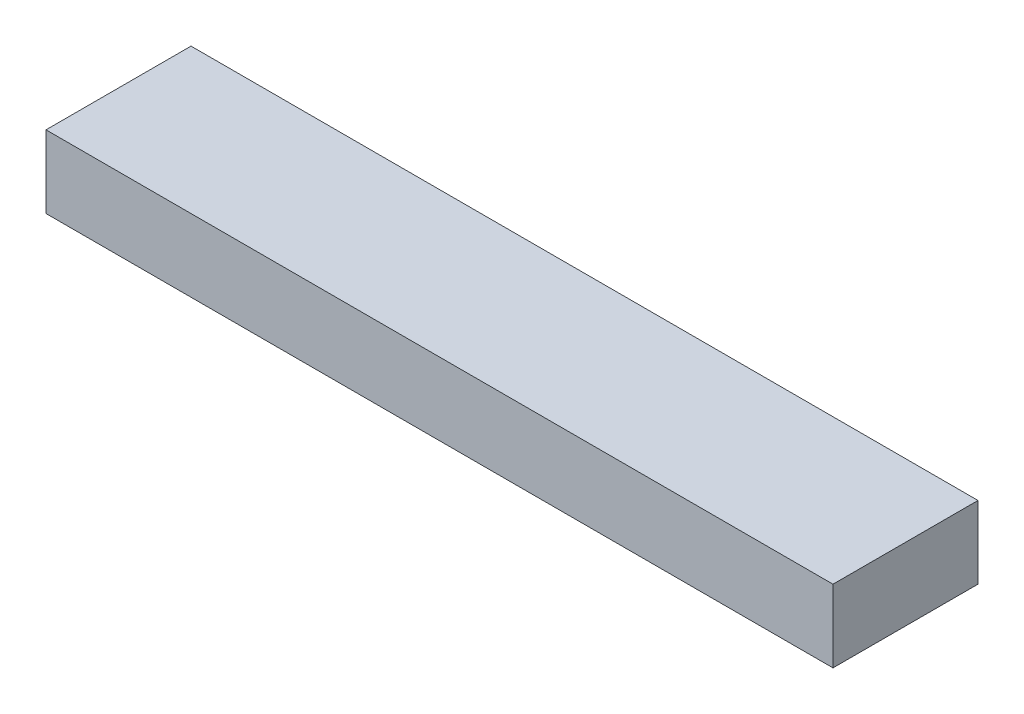
ISO-10303-21;
HEADER;
FILE_DESCRIPTION(('STEP AP214'),'2;1');
FILE_NAME('part.step','',(''),(''),'','','');
FILE_SCHEMA(('AUTOMOTIVE_DESIGN { 1 0 10303 214 1 1 1 1 }'));
ENDSEC;
DATA;
#1=APPLICATION_CONTEXT('core data for automotive mechanical design processes');
#2=APPLICATION_PROTOCOL_DEFINITION('international standard','automotive_design',2000,#1);
#3=PRODUCT_CONTEXT('',#1,'mechanical');
#4=PRODUCT('Part','Part','',(#3));
#5=PRODUCT_RELATED_PRODUCT_CATEGORY('part','',(#4));
#6=PRODUCT_DEFINITION_FORMATION('','',#4);
#7=PRODUCT_DEFINITION_CONTEXT('part definition',#1,'design');
#8=PRODUCT_DEFINITION('design','',#6,#7);
#9=PRODUCT_DEFINITION_SHAPE('','',#8);
#10=(LENGTH_UNIT() NAMED_UNIT(*) SI_UNIT(.MILLI.,.METRE.));
#11=(NAMED_UNIT(*) PLANE_ANGLE_UNIT() SI_UNIT($,.RADIAN.));
#12=(NAMED_UNIT(*) SI_UNIT($,.STERADIAN.) SOLID_ANGLE_UNIT());
#13=UNCERTAINTY_MEASURE_WITH_UNIT(LENGTH_MEASURE(1.E-05),#10,'distance_accuracy_value','');
#14=(GEOMETRIC_REPRESENTATION_CONTEXT(3) GLOBAL_UNCERTAINTY_ASSIGNED_CONTEXT((#13)) GLOBAL_UNIT_ASSIGNED_CONTEXT((#10,
#11,#12)) REPRESENTATION_CONTEXT('',''));
#15=CARTESIAN_POINT('',(0.,0.,0.));
#16=DIRECTION('',(0.,0.,1.));
#17=DIRECTION('',(1.,0.,0.));
#18=AXIS2_PLACEMENT_3D('',#15,#16,#17);
#19=CARTESIAN_POINT('',(108.54,10.,40.));
#20=DIRECTION('',(-1.,0.,0.));
#21=DIRECTION('',(0.,0.,1.));
#22=AXIS2_PLACEMENT_3D('',#19,#20,#21);
#23=PLANE('',#22);
#24=DIRECTION('',(0.,1.,0.));
#25=VECTOR('',#24,1.);
#26=CARTESIAN_POINT('',(108.54,10.,0.));
#27=LINE('',#26,#25);
#28=CARTESIAN_POINT('',(108.54,-10.,0.));
#29=VERTEX_POINT('',#28);
#30=CARTESIAN_POINT('',(108.54,10.,0.));
#31=VERTEX_POINT('',#30);
#32=EDGE_CURVE('E107',#29,#31,#27,.T.);
#33=ORIENTED_EDGE('',*,*,#32,.T.);
#34=DIRECTION('',(0.,0.,-1.));
#35=VECTOR('',#34,1.);
#36=CARTESIAN_POINT('',(108.54,10.,40.));
#37=LINE('',#36,#35);
#38=CARTESIAN_POINT('',(108.54,10.,40.));
#39=VERTEX_POINT('',#38);
#40=EDGE_CURVE('E11',#39,#31,#37,.T.);
#41=ORIENTED_EDGE('',*,*,#40,.F.);
#42=DIRECTION('',(0.,1.,0.));
#43=VECTOR('',#42,1.);
#44=CARTESIAN_POINT('',(108.54,10.,40.));
#45=LINE('',#44,#43);
#46=CARTESIAN_POINT('',(108.54,-10.,40.));
#47=VERTEX_POINT('',#46);
#48=EDGE_CURVE('E91',#47,#39,#45,.T.);
#49=ORIENTED_EDGE('',*,*,#48,.F.);
#50=DIRECTION('',(0.,0.,-1.));
#51=VECTOR('',#50,1.);
#52=CARTESIAN_POINT('',(108.54,-10.,40.));
#53=LINE('',#52,#51);
#54=EDGE_CURVE('E103',#47,#29,#53,.T.);
#55=ORIENTED_EDGE('',*,*,#54,.T.);
#56=EDGE_LOOP('',(#33,#41,#49,#55));
#57=FACE_BOUND('',#56,.T.);
#58=ADVANCED_FACE('F39',(#57),#23,.F.);
#59=CARTESIAN_POINT('',(-108.54,10.,40.));
#60=DIRECTION('',(0.,-1.,0.));
#61=DIRECTION('',(0.,0.,-1.));
#62=AXIS2_PLACEMENT_3D('',#59,#60,#61);
#63=PLANE('',#62);
#64=DIRECTION('',(-1.,0.,0.));
#65=VECTOR('',#64,1.);
#66=CARTESIAN_POINT('',(-108.54,10.,0.));
#67=LINE('',#66,#65);
#68=CARTESIAN_POINT('',(-108.54,10.,0.));
#69=VERTEX_POINT('',#68);
#70=EDGE_CURVE('E96',#31,#69,#67,.T.);
#71=ORIENTED_EDGE('',*,*,#70,.T.);
#72=DIRECTION('',(0.,0.,-1.));
#73=VECTOR('',#72,1.);
#74=CARTESIAN_POINT('',(-108.54,10.,40.));
#75=LINE('',#74,#73);
#76=CARTESIAN_POINT('',(-108.54,10.,40.));
#77=VERTEX_POINT('',#76);
#78=EDGE_CURVE('E48',#77,#69,#75,.T.);
#79=ORIENTED_EDGE('',*,*,#78,.F.);
#80=DIRECTION('',(-1.,0.,0.));
#81=VECTOR('',#80,1.);
#82=CARTESIAN_POINT('',(-108.54,10.,40.));
#83=LINE('',#82,#81);
#84=EDGE_CURVE('E86',#39,#77,#83,.T.);
#85=ORIENTED_EDGE('',*,*,#84,.F.);
#86=ORIENTED_EDGE('',*,*,#40,.T.);
#87=EDGE_LOOP('',(#71,#79,#85,#86));
#88=FACE_BOUND('',#87,.T.);
#89=ADVANCED_FACE('F95',(#88),#63,.F.);
#90=CARTESIAN_POINT('',(-108.54,10.,40.));
#91=DIRECTION('',(1.,0.,0.));
#92=DIRECTION('',(0.,0.,-1.));
#93=AXIS2_PLACEMENT_3D('',#90,#91,#92);
#94=PLANE('',#93);
#95=DIRECTION('',(0.,-1.,0.));
#96=VECTOR('',#95,1.);
#97=CARTESIAN_POINT('',(-108.54,10.,0.));
#98=LINE('',#97,#96);
#99=CARTESIAN_POINT('',(-108.54,-10.,0.));
#100=VERTEX_POINT('',#99);
#101=EDGE_CURVE('E73',#69,#100,#98,.T.);
#102=ORIENTED_EDGE('',*,*,#101,.T.);
#103=DIRECTION('',(0.,0.,-1.));
#104=VECTOR('',#103,1.);
#105=CARTESIAN_POINT('',(-108.54,-10.,40.));
#106=LINE('',#105,#104);
#107=CARTESIAN_POINT('',(-108.54,-10.,40.));
#108=VERTEX_POINT('',#107);
#109=EDGE_CURVE('E98',#108,#100,#106,.T.);
#110=ORIENTED_EDGE('',*,*,#109,.F.);
#111=DIRECTION('',(0.,-1.,0.));
#112=VECTOR('',#111,1.);
#113=CARTESIAN_POINT('',(-108.54,10.,40.));
#114=LINE('',#113,#112);
#115=EDGE_CURVE('E89',#77,#108,#114,.T.);
#116=ORIENTED_EDGE('',*,*,#115,.F.);
#117=ORIENTED_EDGE('',*,*,#78,.T.);
#118=EDGE_LOOP('',(#102,#110,#116,#117));
#119=FACE_BOUND('',#118,.T.);
#120=ADVANCED_FACE('F99',(#119),#94,.F.);
#121=CARTESIAN_POINT('',(-108.54,-10.,40.));
#122=DIRECTION('',(0.,1.,0.));
#123=DIRECTION('',(0.,0.,1.));
#124=AXIS2_PLACEMENT_3D('',#121,#122,#123);
#125=PLANE('',#124);
#126=DIRECTION('',(1.,0.,0.));
#127=VECTOR('',#126,1.);
#128=CARTESIAN_POINT('',(-108.54,-10.,0.));
#129=LINE('',#128,#127);
#130=EDGE_CURVE('E79',#100,#29,#129,.T.);
#131=ORIENTED_EDGE('',*,*,#130,.T.);
#132=ORIENTED_EDGE('',*,*,#54,.F.);
#133=DIRECTION('',(1.,0.,0.));
#134=VECTOR('',#133,1.);
#135=CARTESIAN_POINT('',(-108.54,-10.,40.));
#136=LINE('',#135,#134);
#137=EDGE_CURVE('E56',#108,#47,#136,.T.);
#138=ORIENTED_EDGE('',*,*,#137,.F.);
#139=ORIENTED_EDGE('',*,*,#109,.T.);
#140=EDGE_LOOP('',(#131,#132,#138,#139));
#141=FACE_BOUND('',#140,.T.);
#142=ADVANCED_FACE('F121',(#141),#125,.F.);
#143=CARTESIAN_POINT('',(0.,0.,40.));
#144=DIRECTION('',(0.,0.,1.));
#145=DIRECTION('',(1.,0.,0.));
#146=AXIS2_PLACEMENT_3D('',#143,#144,#145);
#147=PLANE('',#146);
#148=ORIENTED_EDGE('',*,*,#48,.T.);
#149=ORIENTED_EDGE('',*,*,#84,.T.);
#150=ORIENTED_EDGE('',*,*,#115,.T.);
#151=ORIENTED_EDGE('',*,*,#137,.T.);
#152=EDGE_LOOP('',(#148,#149,#150,#151));
#153=FACE_BOUND('',#152,.T.);
#154=ADVANCED_FACE('F87',(#153),#147,.T.);
#155=CARTESIAN_POINT('',(0.,0.,0.));
#156=DIRECTION('',(0.,0.,1.));
#157=DIRECTION('',(1.,0.,0.));
#158=AXIS2_PLACEMENT_3D('',#155,#156,#157);
#159=PLANE('',#158);
#160=CARTESIAN_POINT('',(-56.04,0.,0.));
#161=DIRECTION('',(0.,0.,1.));
#162=DIRECTION('',(1.,0.,0.));
#163=AXIS2_PLACEMENT_3D('',#160,#161,#162);
#164=CIRCLE('',#163,5.);
#165=CARTESIAN_POINT('',(-51.04,0.,0.));
#166=VERTEX_POINT('',#165);
#167=EDGE_CURVE('E136',#166,#166,#164,.T.);
#168=ORIENTED_EDGE('',*,*,#167,.T.);
#169=EDGE_LOOP('',(#168));
#170=FACE_BOUND('',#169,.T.);
#171=CARTESIAN_POINT('',(56.04,0.,0.));
#172=DIRECTION('',(0.,0.,1.));
#173=DIRECTION('',(1.,0.,0.));
#174=AXIS2_PLACEMENT_3D('',#171,#172,#173);
#175=CIRCLE('',#174,5.);
#176=CARTESIAN_POINT('',(61.04,0.,0.));
#177=VERTEX_POINT('',#176);
#178=EDGE_CURVE('E128',#177,#177,#175,.T.);
#179=ORIENTED_EDGE('',*,*,#178,.T.);
#180=EDGE_LOOP('',(#179));
#181=FACE_BOUND('',#180,.T.);
#182=ORIENTED_EDGE('',*,*,#32,.F.);
#183=ORIENTED_EDGE('',*,*,#130,.F.);
#184=ORIENTED_EDGE('',*,*,#101,.F.);
#185=ORIENTED_EDGE('',*,*,#70,.F.);
#186=EDGE_LOOP('',(#182,#183,#184,#185));
#187=FACE_BOUND('',#186,.T.);
#188=ADVANCED_FACE('F124',(#170,#181,#187),#159,.F.);
#189=CARTESIAN_POINT('',(56.04,0.,35.));
#190=DIRECTION('',(0.,0.,-1.));
#191=DIRECTION('',(-1.,0.,0.));
#192=AXIS2_PLACEMENT_3D('',#189,#190,#191);
#193=CYLINDRICAL_SURFACE('',#192,5.);
#194=CARTESIAN_POINT('',(56.04,0.,35.));
#195=DIRECTION('',(0.,0.,1.));
#196=DIRECTION('',(1.,0.,0.));
#197=AXIS2_PLACEMENT_3D('',#194,#195,#196);
#198=CIRCLE('',#197,5.);
#199=CARTESIAN_POINT('',(61.04,0.,35.));
#200=VERTEX_POINT('',#199);
#201=EDGE_CURVE('E132',#200,#200,#198,.T.);
#202=ORIENTED_EDGE('',*,*,#201,.T.);
#203=EDGE_LOOP('',(#202));
#204=FACE_BOUND('',#203,.T.);
#205=ORIENTED_EDGE('',*,*,#178,.F.);
#206=EDGE_LOOP('',(#205));
#207=FACE_BOUND('',#206,.T.);
#208=ADVANCED_FACE('F168',(#204,#207),#193,.F.);
#209=CARTESIAN_POINT('',(56.04,0.,35.));
#210=DIRECTION('',(0.,0.,1.));
#211=DIRECTION('',(1.,0.,0.));
#212=AXIS2_PLACEMENT_3D('',#209,#210,#211);
#213=PLANE('',#212);
#214=ORIENTED_EDGE('',*,*,#201,.F.);
#215=EDGE_LOOP('',(#214));
#216=FACE_BOUND('',#215,.T.);
#217=ADVANCED_FACE('F153',(#216),#213,.F.);
#218=CARTESIAN_POINT('',(-56.04,0.,35.));
#219=DIRECTION('',(0.,0.,-1.));
#220=DIRECTION('',(-1.,0.,0.));
#221=AXIS2_PLACEMENT_3D('',#218,#219,#220);
#222=CYLINDRICAL_SURFACE('',#221,5.);
#223=CARTESIAN_POINT('',(-56.04,0.,35.));
#224=DIRECTION('',(0.,0.,1.));
#225=DIRECTION('',(1.,0.,0.));
#226=AXIS2_PLACEMENT_3D('',#223,#224,#225);
#227=CIRCLE('',#226,5.);
#228=CARTESIAN_POINT('',(-51.04,0.,35.));
#229=VERTEX_POINT('',#228);
#230=EDGE_CURVE('E111',#229,#229,#227,.T.);
#231=ORIENTED_EDGE('',*,*,#230,.T.);
#232=EDGE_LOOP('',(#231));
#233=FACE_BOUND('',#232,.T.);
#234=ORIENTED_EDGE('',*,*,#167,.F.);
#235=EDGE_LOOP('',(#234));
#236=FACE_BOUND('',#235,.T.);
#237=ADVANCED_FACE('F144',(#233,#236),#222,.F.);
#238=CARTESIAN_POINT('',(-56.04,0.,35.));
#239=DIRECTION('',(0.,0.,1.));
#240=DIRECTION('',(1.,0.,0.));
#241=AXIS2_PLACEMENT_3D('',#238,#239,#240);
#242=PLANE('',#241);
#243=ORIENTED_EDGE('',*,*,#230,.F.);
#244=EDGE_LOOP('',(#243));
#245=FACE_BOUND('',#244,.T.);
#246=ADVANCED_FACE('F147',(#245),#242,.F.);
#247=CLOSED_SHELL('',(#58,#89,#120,#142,#154,#188,#208,#217,#237,#246));
#248=MANIFOLD_SOLID_BREP('B2',#247);
#249=ADVANCED_BREP_SHAPE_REPRESENTATION('',(#18,#248),#14);
#250=SHAPE_DEFINITION_REPRESENTATION(#9,#249);
ENDSEC;
END-ISO-10303-21;
